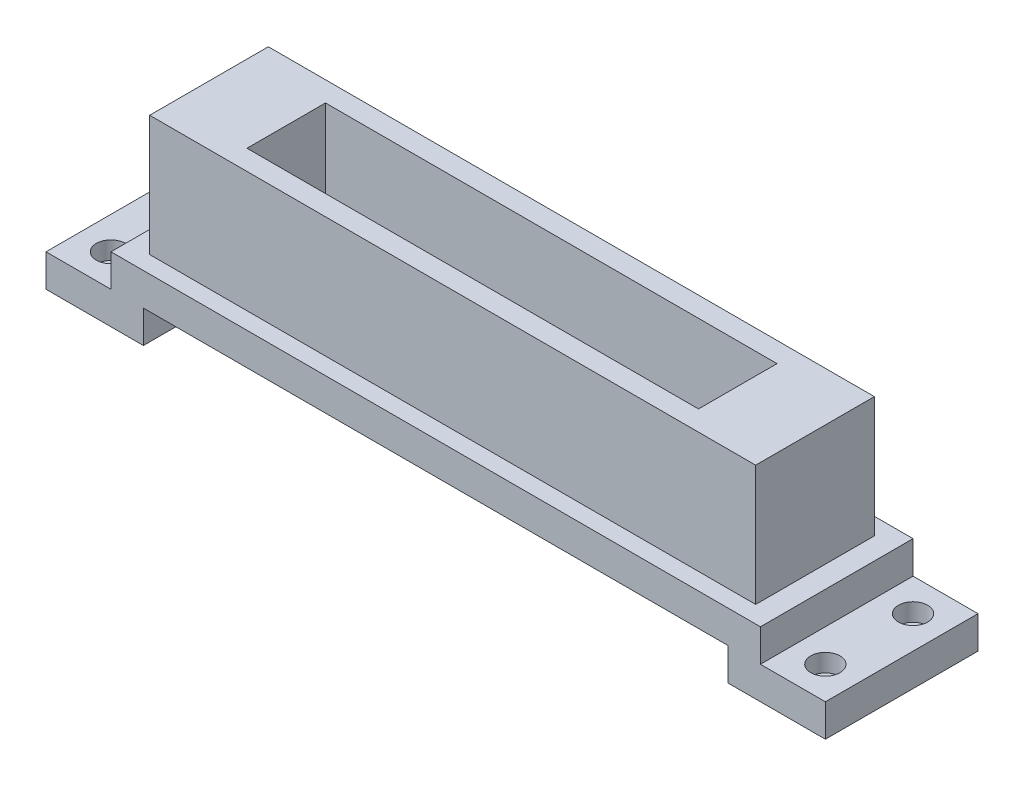
ISO-10303-21;
HEADER;
FILE_DESCRIPTION(('STEP AP214'),'2;1');
FILE_NAME('part.step','',(''),(''),'','','');
FILE_SCHEMA(('AUTOMOTIVE_DESIGN { 1 0 10303 214 1 1 1 1 }'));
ENDSEC;
DATA;
#1=APPLICATION_CONTEXT('core data for automotive mechanical design processes');
#2=APPLICATION_PROTOCOL_DEFINITION('international standard','automotive_design',2000,#1);
#3=PRODUCT_CONTEXT('',#1,'mechanical');
#4=PRODUCT('Part','Part','',(#3));
#5=PRODUCT_RELATED_PRODUCT_CATEGORY('part','',(#4));
#6=PRODUCT_DEFINITION_FORMATION('','',#4);
#7=PRODUCT_DEFINITION_CONTEXT('part definition',#1,'design');
#8=PRODUCT_DEFINITION('design','',#6,#7);
#9=PRODUCT_DEFINITION_SHAPE('','',#8);
#10=(LENGTH_UNIT() NAMED_UNIT(*) SI_UNIT(.MILLI.,.METRE.));
#11=(NAMED_UNIT(*) PLANE_ANGLE_UNIT() SI_UNIT($,.RADIAN.));
#12=(NAMED_UNIT(*) SI_UNIT($,.STERADIAN.) SOLID_ANGLE_UNIT());
#13=UNCERTAINTY_MEASURE_WITH_UNIT(LENGTH_MEASURE(1.E-05),#10,'distance_accuracy_value','');
#14=(GEOMETRIC_REPRESENTATION_CONTEXT(3) GLOBAL_UNCERTAINTY_ASSIGNED_CONTEXT((#13)) GLOBAL_UNIT_ASSIGNED_CONTEXT((#10,
#11,#12)) REPRESENTATION_CONTEXT('',''));
#15=CARTESIAN_POINT('',(0.,0.,0.));
#16=DIRECTION('',(0.,0.,1.));
#17=DIRECTION('',(1.,0.,0.));
#18=AXIS2_PLACEMENT_3D('',#15,#16,#17);
#19=CARTESIAN_POINT('',(0.,20.,0.));
#20=DIRECTION('',(0.,-1.,0.));
#21=DIRECTION('',(0.,0.,-1.));
#22=AXIS2_PLACEMENT_3D('',#19,#20,#21);
#23=PLANE('',#22);
#24=DIRECTION('',(-1.,0.,0.));
#25=VECTOR('',#24,1.);
#26=CARTESIAN_POINT('',(240.,20.,47.));
#27=LINE('',#26,#25);
#28=CARTESIAN_POINT('',(200.,20.,47.));
#29=VERTEX_POINT('',#28);
#30=CARTESIAN_POINT('',(-200.,20.,47.));
#31=VERTEX_POINT('',#30);
#32=EDGE_CURVE('E421',#29,#31,#27,.T.);
#33=ORIENTED_EDGE('',*,*,#32,.F.);
#34=DIRECTION('',(0.,0.,-1.));
#35=VECTOR('',#34,1.);
#36=CARTESIAN_POINT('',(200.,20.,47.));
#37=LINE('',#36,#35);
#38=CARTESIAN_POINT('',(200.,20.,-47.));
#39=VERTEX_POINT('',#38);
#40=EDGE_CURVE('E353',#29,#39,#37,.T.);
#41=ORIENTED_EDGE('',*,*,#40,.T.);
#42=DIRECTION('',(1.,0.,0.));
#43=VECTOR('',#42,1.);
#44=CARTESIAN_POINT('',(-240.,20.,-47.));
#45=LINE('',#44,#43);
#46=CARTESIAN_POINT('',(-200.,20.,-47.));
#47=VERTEX_POINT('',#46);
#48=EDGE_CURVE('E428',#47,#39,#45,.T.);
#49=ORIENTED_EDGE('',*,*,#48,.F.);
#50=DIRECTION('',(0.,0.,-1.));
#51=VECTOR('',#50,1.);
#52=CARTESIAN_POINT('',(-200.,20.,47.));
#53=LINE('',#52,#51);
#54=EDGE_CURVE('E406',#31,#47,#53,.T.);
#55=ORIENTED_EDGE('',*,*,#54,.F.);
#56=EDGE_LOOP('',(#33,#41,#49,#55));
#57=FACE_BOUND('',#56,.T.);
#58=DIRECTION('',(0.,0.,-1.));
#59=VECTOR('',#58,1.);
#60=CARTESIAN_POINT('',(186.614845009006,20.,36.5494359654945));
#61=LINE('',#60,#59);
#62=CARTESIAN_POINT('',(186.614845009006,20.,36.5494359654945));
#63=VERTEX_POINT('',#62);
#64=CARTESIAN_POINT('',(186.614845009006,20.,-36.5494359654945));
#65=VERTEX_POINT('',#64);
#66=EDGE_CURVE('E66',#63,#65,#61,.T.);
#67=ORIENTED_EDGE('',*,*,#66,.F.);
#68=DIRECTION('',(1.,0.,0.));
#69=VECTOR('',#68,1.);
#70=CARTESIAN_POINT('',(-186.614845009006,20.,36.5494359654945));
#71=LINE('',#70,#69);
#72=CARTESIAN_POINT('',(-186.614845009006,20.,36.5494359654945));
#73=VERTEX_POINT('',#72);
#74=EDGE_CURVE('E232',#73,#63,#71,.T.);
#75=ORIENTED_EDGE('',*,*,#74,.F.);
#76=DIRECTION('',(0.,0.,1.));
#77=VECTOR('',#76,1.);
#78=CARTESIAN_POINT('',(-186.614845009006,20.,36.5494359654945));
#79=LINE('',#78,#77);
#80=CARTESIAN_POINT('',(-186.614845009006,20.,-36.5494359654945));
#81=VERTEX_POINT('',#80);
#82=EDGE_CURVE('E252',#81,#73,#79,.T.);
#83=ORIENTED_EDGE('',*,*,#82,.F.);
#84=DIRECTION('',(-1.,0.,0.));
#85=VECTOR('',#84,1.);
#86=CARTESIAN_POINT('',(-186.614845009006,20.,-36.5494359654945));
#87=LINE('',#86,#85);
#88=EDGE_CURVE('E250',#65,#81,#87,.T.);
#89=ORIENTED_EDGE('',*,*,#88,.F.);
#90=EDGE_LOOP('',(#67,#75,#83,#89));
#91=FACE_BOUND('',#90,.T.);
#92=ADVANCED_FACE('F43',(#57,#91),#23,.F.);
#93=CARTESIAN_POINT('',(240.,20.,47.));
#94=DIRECTION('',(0.,0.,1.));
#95=DIRECTION('',(1.,0.,0.));
#96=AXIS2_PLACEMENT_3D('',#93,#94,#95);
#97=PLANE('',#96);
#98=DIRECTION('',(-1.,0.,0.));
#99=VECTOR('',#98,1.);
#100=CARTESIAN_POINT('',(240.,0.,47.));
#101=LINE('',#100,#99);
#102=CARTESIAN_POINT('',(240.,0.,47.));
#103=VERTEX_POINT('',#102);
#104=CARTESIAN_POINT('',(200.,0.,47.));
#105=VERTEX_POINT('',#104);
#106=EDGE_CURVE('E340',#103,#105,#101,.T.);
#107=ORIENTED_EDGE('',*,*,#106,.T.);
#108=DIRECTION('',(0.,1.,0.));
#109=VECTOR('',#108,1.);
#110=CARTESIAN_POINT('',(200.,0.,47.));
#111=LINE('',#110,#109);
#112=EDGE_CURVE('E344',#105,#29,#111,.T.);
#113=ORIENTED_EDGE('',*,*,#112,.T.);
#114=ORIENTED_EDGE('',*,*,#32,.T.);
#115=DIRECTION('',(0.,-1.,0.));
#116=VECTOR('',#115,1.);
#117=CARTESIAN_POINT('',(-200.,20.,47.));
#118=LINE('',#117,#116);
#119=CARTESIAN_POINT('',(-200.,0.,47.));
#120=VERTEX_POINT('',#119);
#121=EDGE_CURVE('E396',#31,#120,#118,.T.);
#122=ORIENTED_EDGE('',*,*,#121,.T.);
#123=DIRECTION('',(-1.,0.,0.));
#124=VECTOR('',#123,1.);
#125=CARTESIAN_POINT('',(-200.,0.,47.));
#126=LINE('',#125,#124);
#127=CARTESIAN_POINT('',(-240.,0.,47.));
#128=VERTEX_POINT('',#127);
#129=EDGE_CURVE('E405',#120,#128,#126,.T.);
#130=ORIENTED_EDGE('',*,*,#129,.T.);
#131=DIRECTION('',(0.,-1.,0.));
#132=VECTOR('',#131,1.);
#133=CARTESIAN_POINT('',(-240.,20.,47.));
#134=LINE('',#133,#132);
#135=CARTESIAN_POINT('',(-240.,-20.,47.));
#136=VERTEX_POINT('',#135);
#137=EDGE_CURVE('E449',#128,#136,#134,.T.);
#138=ORIENTED_EDGE('',*,*,#137,.T.);
#139=DIRECTION('',(-1.,0.,0.));
#140=VECTOR('',#139,1.);
#141=CARTESIAN_POINT('',(240.,-20.,47.));
#142=LINE('',#141,#140);
#143=CARTESIAN_POINT('',(-180.,-20.,47.));
#144=VERTEX_POINT('',#143);
#145=EDGE_CURVE('E432',#144,#136,#142,.T.);
#146=ORIENTED_EDGE('',*,*,#145,.F.);
#147=DIRECTION('',(0.,1.,0.));
#148=VECTOR('',#147,1.);
#149=CARTESIAN_POINT('',(-180.,-20.,47.));
#150=LINE('',#149,#148);
#151=CARTESIAN_POINT('',(-180.,0.,47.));
#152=VERTEX_POINT('',#151);
#153=EDGE_CURVE('E366',#144,#152,#150,.T.);
#154=ORIENTED_EDGE('',*,*,#153,.T.);
#155=DIRECTION('',(1.,0.,0.));
#156=VECTOR('',#155,1.);
#157=CARTESIAN_POINT('',(-180.,0.,47.));
#158=LINE('',#157,#156);
#159=CARTESIAN_POINT('',(180.,0.,47.));
#160=VERTEX_POINT('',#159);
#161=EDGE_CURVE('E371',#152,#160,#158,.T.);
#162=ORIENTED_EDGE('',*,*,#161,.T.);
#163=DIRECTION('',(0.,-1.,0.));
#164=VECTOR('',#163,1.);
#165=CARTESIAN_POINT('',(180.,0.,47.));
#166=LINE('',#165,#164);
#167=CARTESIAN_POINT('',(180.,-20.,47.));
#168=VERTEX_POINT('',#167);
#169=EDGE_CURVE('E365',#160,#168,#166,.T.);
#170=ORIENTED_EDGE('',*,*,#169,.T.);
#171=CARTESIAN_POINT('',(240.,-20.,47.));
#172=VERTEX_POINT('',#171);
#173=EDGE_CURVE('E434',#172,#168,#142,.T.);
#174=ORIENTED_EDGE('',*,*,#173,.F.);
#175=DIRECTION('',(0.,-1.,0.));
#176=VECTOR('',#175,1.);
#177=CARTESIAN_POINT('',(240.,20.,47.));
#178=LINE('',#177,#176);
#179=EDGE_CURVE('E50',#103,#172,#178,.T.);
#180=ORIENTED_EDGE('',*,*,#179,.F.);
#181=EDGE_LOOP('',(#107,#113,#114,#122,#130,#138,#146,#154,#162,#170,#174,#180));
#182=FACE_BOUND('',#181,.T.);
#183=ADVANCED_FACE('F462',(#182),#97,.T.);
#184=CARTESIAN_POINT('',(0.,-20.,0.));
#185=DIRECTION('',(0.,-1.,0.));
#186=DIRECTION('',(0.,0.,-1.));
#187=AXIS2_PLACEMENT_3D('',#184,#185,#186);
#188=PLANE('',#187);
#189=CARTESIAN_POINT('',(220.,-20.,27.));
#190=DIRECTION('',(0.,1.,0.));
#191=DIRECTION('',(0.,0.,1.));
#192=AXIS2_PLACEMENT_3D('',#189,#190,#191);
#193=CIRCLE('',#192,5.50000000000001);
#194=CARTESIAN_POINT('',(220.,-20.,32.5));
#195=VERTEX_POINT('',#194);
#196=EDGE_CURVE('E281',#195,#195,#193,.T.);
#197=ORIENTED_EDGE('',*,*,#196,.T.);
#198=EDGE_LOOP('',(#197));
#199=FACE_BOUND('',#198,.T.);
#200=CARTESIAN_POINT('',(220.,-20.,-27.));
#201=DIRECTION('',(0.,1.,0.));
#202=DIRECTION('',(0.,0.,1.));
#203=AXIS2_PLACEMENT_3D('',#200,#201,#202);
#204=CIRCLE('',#203,5.50000000000001);
#205=CARTESIAN_POINT('',(220.,-20.,-21.5));
#206=VERTEX_POINT('',#205);
#207=EDGE_CURVE('E297',#206,#206,#204,.T.);
#208=ORIENTED_EDGE('',*,*,#207,.T.);
#209=EDGE_LOOP('',(#208));
#210=FACE_BOUND('',#209,.T.);
#211=ORIENTED_EDGE('',*,*,#173,.T.);
#212=DIRECTION('',(0.,0.,-1.));
#213=VECTOR('',#212,1.);
#214=CARTESIAN_POINT('',(180.,-20.,47.));
#215=LINE('',#214,#213);
#216=CARTESIAN_POINT('',(180.,-20.,-47.));
#217=VERTEX_POINT('',#216);
#218=EDGE_CURVE('E374',#168,#217,#215,.T.);
#219=ORIENTED_EDGE('',*,*,#218,.T.);
#220=DIRECTION('',(1.,0.,0.));
#221=VECTOR('',#220,1.);
#222=CARTESIAN_POINT('',(-240.,-20.,-47.));
#223=LINE('',#222,#221);
#224=CARTESIAN_POINT('',(240.,-20.,-47.));
#225=VERTEX_POINT('',#224);
#226=EDGE_CURVE('E442',#217,#225,#223,.T.);
#227=ORIENTED_EDGE('',*,*,#226,.T.);
#228=DIRECTION('',(0.,0.,1.));
#229=VECTOR('',#228,1.);
#230=CARTESIAN_POINT('',(240.,-20.,-47.));
#231=LINE('',#230,#229);
#232=EDGE_CURVE('E420',#225,#172,#231,.T.);
#233=ORIENTED_EDGE('',*,*,#232,.T.);
#234=EDGE_LOOP('',(#211,#219,#227,#233));
#235=FACE_BOUND('',#234,.T.);
#236=ADVANCED_FACE('F466',(#199,#210,#235),#188,.T.);
#237=CARTESIAN_POINT('',(-240.,20.,47.));
#238=DIRECTION('',(-1.,0.,0.));
#239=DIRECTION('',(0.,0.,1.));
#240=AXIS2_PLACEMENT_3D('',#237,#238,#239);
#241=PLANE('',#240);
#242=ORIENTED_EDGE('',*,*,#137,.F.);
#243=DIRECTION('',(0.,0.,-1.));
#244=VECTOR('',#243,1.);
#245=CARTESIAN_POINT('',(-240.,0.,47.));
#246=LINE('',#245,#244);
#247=CARTESIAN_POINT('',(-240.,0.,-47.));
#248=VERTEX_POINT('',#247);
#249=EDGE_CURVE('E414',#128,#248,#246,.T.);
#250=ORIENTED_EDGE('',*,*,#249,.T.);
#251=DIRECTION('',(0.,-1.,0.));
#252=VECTOR('',#251,1.);
#253=CARTESIAN_POINT('',(-240.,20.,-47.));
#254=LINE('',#253,#252);
#255=CARTESIAN_POINT('',(-240.,-20.,-47.));
#256=VERTEX_POINT('',#255);
#257=EDGE_CURVE('E52',#248,#256,#254,.T.);
#258=ORIENTED_EDGE('',*,*,#257,.T.);
#259=DIRECTION('',(0.,0.,-1.));
#260=VECTOR('',#259,1.);
#261=CARTESIAN_POINT('',(-240.,-20.,47.));
#262=LINE('',#261,#260);
#263=EDGE_CURVE('E437',#136,#256,#262,.T.);
#264=ORIENTED_EDGE('',*,*,#263,.F.);
#265=EDGE_LOOP('',(#242,#250,#258,#264));
#266=FACE_BOUND('',#265,.T.);
#267=ADVANCED_FACE('F556',(#266),#241,.T.);
#268=CARTESIAN_POINT('',(240.,20.,-47.));
#269=DIRECTION('',(1.,0.,0.));
#270=DIRECTION('',(0.,0.,-1.));
#271=AXIS2_PLACEMENT_3D('',#268,#269,#270);
#272=PLANE('',#271);
#273=DIRECTION('',(0.,0.,-1.));
#274=VECTOR('',#273,1.);
#275=CARTESIAN_POINT('',(240.,0.,47.));
#276=LINE('',#275,#274);
#277=CARTESIAN_POINT('',(240.,0.,-47.));
#278=VERTEX_POINT('',#277);
#279=EDGE_CURVE('E347',#103,#278,#276,.T.);
#280=ORIENTED_EDGE('',*,*,#279,.F.);
#281=ORIENTED_EDGE('',*,*,#179,.T.);
#282=ORIENTED_EDGE('',*,*,#232,.F.);
#283=DIRECTION('',(0.,-1.,0.));
#284=VECTOR('',#283,1.);
#285=CARTESIAN_POINT('',(240.,20.,-47.));
#286=LINE('',#285,#284);
#287=EDGE_CURVE('E11',#278,#225,#286,.T.);
#288=ORIENTED_EDGE('',*,*,#287,.F.);
#289=EDGE_LOOP('',(#280,#281,#282,#288));
#290=FACE_BOUND('',#289,.T.);
#291=ADVANCED_FACE('F44',(#290),#272,.T.);
#292=CARTESIAN_POINT('',(-240.,20.,-47.));
#293=DIRECTION('',(0.,0.,-1.));
#294=DIRECTION('',(-1.,0.,0.));
#295=AXIS2_PLACEMENT_3D('',#292,#293,#294);
#296=PLANE('',#295);
#297=DIRECTION('',(-1.,0.,0.));
#298=VECTOR('',#297,1.);
#299=CARTESIAN_POINT('',(240.,0.,-47.));
#300=LINE('',#299,#298);
#301=CARTESIAN_POINT('',(200.,0.,-47.));
#302=VERTEX_POINT('',#301);
#303=EDGE_CURVE('E337',#278,#302,#300,.T.);
#304=ORIENTED_EDGE('',*,*,#303,.F.);
#305=ORIENTED_EDGE('',*,*,#287,.T.);
#306=ORIENTED_EDGE('',*,*,#226,.F.);
#307=DIRECTION('',(0.,-1.,0.));
#308=VECTOR('',#307,1.);
#309=CARTESIAN_POINT('',(180.,0.,-47.));
#310=LINE('',#309,#308);
#311=CARTESIAN_POINT('',(180.,0.,-47.));
#312=VERTEX_POINT('',#311);
#313=EDGE_CURVE('E354',#312,#217,#310,.T.);
#314=ORIENTED_EDGE('',*,*,#313,.F.);
#315=DIRECTION('',(1.,0.,0.));
#316=VECTOR('',#315,1.);
#317=CARTESIAN_POINT('',(-180.,0.,-47.));
#318=LINE('',#317,#316);
#319=CARTESIAN_POINT('',(-180.,0.,-47.));
#320=VERTEX_POINT('',#319);
#321=EDGE_CURVE('E370',#320,#312,#318,.T.);
#322=ORIENTED_EDGE('',*,*,#321,.F.);
#323=DIRECTION('',(0.,1.,0.));
#324=VECTOR('',#323,1.);
#325=CARTESIAN_POINT('',(-180.,-20.,-47.));
#326=LINE('',#325,#324);
#327=CARTESIAN_POINT('',(-180.,-20.,-47.));
#328=VERTEX_POINT('',#327);
#329=EDGE_CURVE('E377',#328,#320,#326,.T.);
#330=ORIENTED_EDGE('',*,*,#329,.F.);
#331=EDGE_CURVE('E430',#256,#328,#223,.T.);
#332=ORIENTED_EDGE('',*,*,#331,.F.);
#333=ORIENTED_EDGE('',*,*,#257,.F.);
#334=DIRECTION('',(-1.,0.,0.));
#335=VECTOR('',#334,1.);
#336=CARTESIAN_POINT('',(-200.,0.,-47.));
#337=LINE('',#336,#335);
#338=CARTESIAN_POINT('',(-200.,0.,-47.));
#339=VERTEX_POINT('',#338);
#340=EDGE_CURVE('E401',#339,#248,#337,.T.);
#341=ORIENTED_EDGE('',*,*,#340,.F.);
#342=DIRECTION('',(0.,-1.,0.));
#343=VECTOR('',#342,1.);
#344=CARTESIAN_POINT('',(-200.,20.,-47.));
#345=LINE('',#344,#343);
#346=EDGE_CURVE('E386',#47,#339,#345,.T.);
#347=ORIENTED_EDGE('',*,*,#346,.F.);
#348=ORIENTED_EDGE('',*,*,#48,.T.);
#349=DIRECTION('',(0.,1.,0.));
#350=VECTOR('',#349,1.);
#351=CARTESIAN_POINT('',(200.,0.,-47.));
#352=LINE('',#351,#350);
#353=EDGE_CURVE('E341',#302,#39,#352,.T.);
#354=ORIENTED_EDGE('',*,*,#353,.F.);
#355=EDGE_LOOP('',(#304,#305,#306,#314,#322,#330,#332,#333,#341,#347,#348,#354));
#356=FACE_BOUND('',#355,.T.);
#357=ADVANCED_FACE('F551',(#356),#296,.T.);
#358=CARTESIAN_POINT('',(-220.,-20.,27.));
#359=DIRECTION('',(0.,1.,0.));
#360=DIRECTION('',(0.,0.,1.));
#361=AXIS2_PLACEMENT_3D('',#358,#359,#360);
#362=CIRCLE('',#361,5.50000000000001);
#363=CARTESIAN_POINT('',(-220.,-20.,32.5));
#364=VERTEX_POINT('',#363);
#365=EDGE_CURVE('E317',#364,#364,#362,.T.);
#366=ORIENTED_EDGE('',*,*,#365,.T.);
#367=EDGE_LOOP('',(#366));
#368=FACE_BOUND('',#367,.T.);
#369=CARTESIAN_POINT('',(-220.,-20.,-27.));
#370=DIRECTION('',(0.,1.,0.));
#371=DIRECTION('',(0.,0.,1.));
#372=AXIS2_PLACEMENT_3D('',#369,#370,#371);
#373=CIRCLE('',#372,5.50000000000001);
#374=CARTESIAN_POINT('',(-220.,-20.,-21.5));
#375=VERTEX_POINT('',#374);
#376=EDGE_CURVE('E335',#375,#375,#373,.T.);
#377=ORIENTED_EDGE('',*,*,#376,.T.);
#378=EDGE_LOOP('',(#377));
#379=FACE_BOUND('',#378,.T.);
#380=DIRECTION('',(0.,0.,-1.));
#381=VECTOR('',#380,1.);
#382=CARTESIAN_POINT('',(-180.,-20.,47.));
#383=LINE('',#382,#381);
#384=EDGE_CURVE('E395',#144,#328,#383,.T.);
#385=ORIENTED_EDGE('',*,*,#384,.F.);
#386=ORIENTED_EDGE('',*,*,#145,.T.);
#387=ORIENTED_EDGE('',*,*,#263,.T.);
#388=ORIENTED_EDGE('',*,*,#331,.T.);
#389=EDGE_LOOP('',(#385,#386,#387,#388));
#390=FACE_BOUND('',#389,.T.);
#391=ADVANCED_FACE('F542',(#368,#379,#390),#188,.T.);
#392=CARTESIAN_POINT('',(-200.,0.,47.));
#393=DIRECTION('',(0.,-1.,0.));
#394=DIRECTION('',(0.,0.,-1.));
#395=AXIS2_PLACEMENT_3D('',#392,#393,#394);
#396=PLANE('',#395);
#397=CARTESIAN_POINT('',(-220.,0.,27.));
#398=DIRECTION('',(0.,1.,0.));
#399=DIRECTION('',(0.,0.,1.));
#400=AXIS2_PLACEMENT_3D('',#397,#398,#399);
#401=CIRCLE('',#400,8.99999999999998);
#402=CARTESIAN_POINT('',(-220.,0.,36.));
#403=VERTEX_POINT('',#402);
#404=EDGE_CURVE('E302',#403,#403,#401,.T.);
#405=ORIENTED_EDGE('',*,*,#404,.F.);
#406=EDGE_LOOP('',(#405));
#407=FACE_BOUND('',#406,.T.);
#408=CARTESIAN_POINT('',(-220.,0.,-27.));
#409=DIRECTION('',(0.,1.,0.));
#410=DIRECTION('',(0.,0.,1.));
#411=AXIS2_PLACEMENT_3D('',#408,#409,#410);
#412=CIRCLE('',#411,8.99999999999998);
#413=CARTESIAN_POINT('',(-220.,0.,-18.));
#414=VERTEX_POINT('',#413);
#415=EDGE_CURVE('E318',#414,#414,#412,.T.);
#416=ORIENTED_EDGE('',*,*,#415,.F.);
#417=EDGE_LOOP('',(#416));
#418=FACE_BOUND('',#417,.T.);
#419=ORIENTED_EDGE('',*,*,#340,.T.);
#420=ORIENTED_EDGE('',*,*,#249,.F.);
#421=ORIENTED_EDGE('',*,*,#129,.F.);
#422=DIRECTION('',(0.,0.,-1.));
#423=VECTOR('',#422,1.);
#424=CARTESIAN_POINT('',(-200.,0.,47.));
#425=LINE('',#424,#423);
#426=EDGE_CURVE('E416',#120,#339,#425,.T.);
#427=ORIENTED_EDGE('',*,*,#426,.T.);
#428=EDGE_LOOP('',(#419,#420,#421,#427));
#429=FACE_BOUND('',#428,.T.);
#430=ADVANCED_FACE('F561',(#407,#418,#429),#396,.F.);
#431=CARTESIAN_POINT('',(-200.,20.,47.));
#432=DIRECTION('',(1.,0.,0.));
#433=DIRECTION('',(0.,0.,-1.));
#434=AXIS2_PLACEMENT_3D('',#431,#432,#433);
#435=PLANE('',#434);
#436=ORIENTED_EDGE('',*,*,#346,.T.);
#437=ORIENTED_EDGE('',*,*,#426,.F.);
#438=ORIENTED_EDGE('',*,*,#121,.F.);
#439=ORIENTED_EDGE('',*,*,#54,.T.);
#440=EDGE_LOOP('',(#436,#437,#438,#439));
#441=FACE_BOUND('',#440,.T.);
#442=ADVANCED_FACE('F566',(#441),#435,.F.);
#443=CARTESIAN_POINT('',(180.,0.,47.));
#444=DIRECTION('',(1.,0.,0.));
#445=DIRECTION('',(0.,0.,-1.));
#446=AXIS2_PLACEMENT_3D('',#443,#444,#445);
#447=PLANE('',#446);
#448=ORIENTED_EDGE('',*,*,#313,.T.);
#449=ORIENTED_EDGE('',*,*,#218,.F.);
#450=ORIENTED_EDGE('',*,*,#169,.F.);
#451=DIRECTION('',(0.,0.,-1.));
#452=VECTOR('',#451,1.);
#453=CARTESIAN_POINT('',(180.,0.,47.));
#454=LINE('',#453,#452);
#455=EDGE_CURVE('E381',#160,#312,#454,.T.);
#456=ORIENTED_EDGE('',*,*,#455,.T.);
#457=EDGE_LOOP('',(#448,#449,#450,#456));
#458=FACE_BOUND('',#457,.T.);
#459=ADVANCED_FACE('F553',(#458),#447,.F.);
#460=CARTESIAN_POINT('',(-180.,0.,47.));
#461=DIRECTION('',(0.,1.,0.));
#462=DIRECTION('',(0.,0.,1.));
#463=AXIS2_PLACEMENT_3D('',#460,#461,#462);
#464=PLANE('',#463);
#465=ORIENTED_EDGE('',*,*,#321,.T.);
#466=ORIENTED_EDGE('',*,*,#455,.F.);
#467=ORIENTED_EDGE('',*,*,#161,.F.);
#468=DIRECTION('',(0.,0.,-1.));
#469=VECTOR('',#468,1.);
#470=CARTESIAN_POINT('',(-180.,0.,47.));
#471=LINE('',#470,#469);
#472=EDGE_CURVE('E390',#152,#320,#471,.T.);
#473=ORIENTED_EDGE('',*,*,#472,.T.);
#474=EDGE_LOOP('',(#465,#466,#467,#473));
#475=FACE_BOUND('',#474,.T.);
#476=ADVANCED_FACE('F547',(#475),#464,.F.);
#477=CARTESIAN_POINT('',(-180.,-20.,47.));
#478=DIRECTION('',(-1.,0.,0.));
#479=DIRECTION('',(0.,0.,1.));
#480=AXIS2_PLACEMENT_3D('',#477,#478,#479);
#481=PLANE('',#480);
#482=ORIENTED_EDGE('',*,*,#329,.T.);
#483=ORIENTED_EDGE('',*,*,#472,.F.);
#484=ORIENTED_EDGE('',*,*,#153,.F.);
#485=ORIENTED_EDGE('',*,*,#384,.T.);
#486=EDGE_LOOP('',(#482,#483,#484,#485));
#487=FACE_BOUND('',#486,.T.);
#488=ADVANCED_FACE('F543',(#487),#481,.F.);
#489=CARTESIAN_POINT('',(200.,0.,47.));
#490=DIRECTION('',(-1.,0.,0.));
#491=DIRECTION('',(0.,0.,1.));
#492=AXIS2_PLACEMENT_3D('',#489,#490,#491);
#493=PLANE('',#492);
#494=ORIENTED_EDGE('',*,*,#353,.T.);
#495=ORIENTED_EDGE('',*,*,#40,.F.);
#496=ORIENTED_EDGE('',*,*,#112,.F.);
#497=DIRECTION('',(0.,0.,-1.));
#498=VECTOR('',#497,1.);
#499=CARTESIAN_POINT('',(200.,0.,47.));
#500=LINE('',#499,#498);
#501=EDGE_CURVE('E358',#105,#302,#500,.T.);
#502=ORIENTED_EDGE('',*,*,#501,.T.);
#503=EDGE_LOOP('',(#494,#495,#496,#502));
#504=FACE_BOUND('',#503,.T.);
#505=ADVANCED_FACE('F571',(#504),#493,.F.);
#506=CARTESIAN_POINT('',(240.,0.,47.));
#507=DIRECTION('',(0.,-1.,0.));
#508=DIRECTION('',(0.,0.,-1.));
#509=AXIS2_PLACEMENT_3D('',#506,#507,#508);
#510=PLANE('',#509);
#511=CARTESIAN_POINT('',(220.,0.,27.));
#512=DIRECTION('',(0.,1.,0.));
#513=DIRECTION('',(0.,0.,1.));
#514=AXIS2_PLACEMENT_3D('',#511,#512,#513);
#515=CIRCLE('',#514,8.99999999999998);
#516=CARTESIAN_POINT('',(220.,0.,36.));
#517=VERTEX_POINT('',#516);
#518=EDGE_CURVE('E275',#517,#517,#515,.T.);
#519=ORIENTED_EDGE('',*,*,#518,.F.);
#520=EDGE_LOOP('',(#519));
#521=FACE_BOUND('',#520,.T.);
#522=CARTESIAN_POINT('',(220.,0.,-27.));
#523=DIRECTION('',(0.,1.,0.));
#524=DIRECTION('',(0.,0.,1.));
#525=AXIS2_PLACEMENT_3D('',#522,#523,#524);
#526=CIRCLE('',#525,8.99999999999998);
#527=CARTESIAN_POINT('',(220.,0.,-18.));
#528=VERTEX_POINT('',#527);
#529=EDGE_CURVE('E286',#528,#528,#526,.T.);
#530=ORIENTED_EDGE('',*,*,#529,.F.);
#531=EDGE_LOOP('',(#530));
#532=FACE_BOUND('',#531,.T.);
#533=ORIENTED_EDGE('',*,*,#303,.T.);
#534=ORIENTED_EDGE('',*,*,#501,.F.);
#535=ORIENTED_EDGE('',*,*,#106,.F.);
#536=ORIENTED_EDGE('',*,*,#279,.T.);
#537=EDGE_LOOP('',(#533,#534,#535,#536));
#538=FACE_BOUND('',#537,.T.);
#539=ADVANCED_FACE('F573',(#521,#532,#538),#510,.F.);
#540=CARTESIAN_POINT('',(-220.,0.,-27.));
#541=DIRECTION('',(0.,1.,0.));
#542=DIRECTION('',(0.,0.,1.));
#543=AXIS2_PLACEMENT_3D('',#540,#541,#542);
#544=CYLINDRICAL_SURFACE('',#543,5.50000000000001);
#545=ORIENTED_EDGE('',*,*,#376,.F.);
#546=EDGE_LOOP('',(#545));
#547=FACE_BOUND('',#546,.T.);
#548=CARTESIAN_POINT('',(-220.,-11.,-27.));
#549=DIRECTION('',(0.,1.,0.));
#550=DIRECTION('',(0.,0.,1.));
#551=AXIS2_PLACEMENT_3D('',#548,#549,#550);
#552=CIRCLE('',#551,5.50000000000001);
#553=CARTESIAN_POINT('',(-220.,-11.,-21.5));
#554=VERTEX_POINT('',#553);
#555=EDGE_CURVE('E329',#554,#554,#552,.T.);
#556=ORIENTED_EDGE('',*,*,#555,.T.);
#557=EDGE_LOOP('',(#556));
#558=FACE_BOUND('',#557,.T.);
#559=ADVANCED_FACE('F577',(#547,#558),#544,.F.);
#560=CARTESIAN_POINT('',(-214.5,-11.,-27.));
#561=DIRECTION('',(0.,-1.,0.));
#562=DIRECTION('',(0.,0.,-1.));
#563=AXIS2_PLACEMENT_3D('',#560,#561,#562);
#564=PLANE('',#563);
#565=ORIENTED_EDGE('',*,*,#555,.F.);
#566=EDGE_LOOP('',(#565));
#567=FACE_BOUND('',#566,.T.);
#568=CARTESIAN_POINT('',(-220.,-11.,-27.));
#569=DIRECTION('',(0.,1.,0.));
#570=DIRECTION('',(0.,0.,1.));
#571=AXIS2_PLACEMENT_3D('',#568,#569,#570);
#572=CIRCLE('',#571,8.99999999999998);
#573=CARTESIAN_POINT('',(-220.,-11.,-18.));
#574=VERTEX_POINT('',#573);
#575=EDGE_CURVE('E323',#574,#574,#572,.T.);
#576=ORIENTED_EDGE('',*,*,#575,.T.);
#577=EDGE_LOOP('',(#576));
#578=FACE_BOUND('',#577,.T.);
#579=ADVANCED_FACE('F585',(#567,#578),#564,.F.);
#580=CARTESIAN_POINT('',(-220.,0.,-27.));
#581=DIRECTION('',(0.,1.,0.));
#582=DIRECTION('',(0.,0.,1.));
#583=AXIS2_PLACEMENT_3D('',#580,#581,#582);
#584=CYLINDRICAL_SURFACE('',#583,8.99999999999998);
#585=ORIENTED_EDGE('',*,*,#575,.F.);
#586=EDGE_LOOP('',(#585));
#587=FACE_BOUND('',#586,.T.);
#588=ORIENTED_EDGE('',*,*,#415,.T.);
#589=EDGE_LOOP('',(#588));
#590=FACE_BOUND('',#589,.T.);
#591=ADVANCED_FACE('F658',(#587,#590),#584,.F.);
#592=CARTESIAN_POINT('',(-220.,0.,27.));
#593=DIRECTION('',(0.,1.,0.));
#594=DIRECTION('',(0.,0.,1.));
#595=AXIS2_PLACEMENT_3D('',#592,#593,#594);
#596=CYLINDRICAL_SURFACE('',#595,5.50000000000001);
#597=ORIENTED_EDGE('',*,*,#365,.F.);
#598=EDGE_LOOP('',(#597));
#599=FACE_BOUND('',#598,.T.);
#600=CARTESIAN_POINT('',(-220.,-11.,27.));
#601=DIRECTION('',(0.,1.,0.));
#602=DIRECTION('',(0.,0.,1.));
#603=AXIS2_PLACEMENT_3D('',#600,#601,#602);
#604=CIRCLE('',#603,5.50000000000001);
#605=CARTESIAN_POINT('',(-220.,-11.,32.5));
#606=VERTEX_POINT('',#605);
#607=EDGE_CURVE('E315',#606,#606,#604,.T.);
#608=ORIENTED_EDGE('',*,*,#607,.T.);
#609=EDGE_LOOP('',(#608));
#610=FACE_BOUND('',#609,.T.);
#611=ADVANCED_FACE('F655',(#599,#610),#596,.F.);
#612=CARTESIAN_POINT('',(-214.5,-11.,27.));
#613=DIRECTION('',(0.,-1.,0.));
#614=DIRECTION('',(0.,0.,-1.));
#615=AXIS2_PLACEMENT_3D('',#612,#613,#614);
#616=PLANE('',#615);
#617=ORIENTED_EDGE('',*,*,#607,.F.);
#618=EDGE_LOOP('',(#617));
#619=FACE_BOUND('',#618,.T.);
#620=CARTESIAN_POINT('',(-220.,-11.,27.));
#621=DIRECTION('',(0.,1.,0.));
#622=DIRECTION('',(0.,0.,1.));
#623=AXIS2_PLACEMENT_3D('',#620,#621,#622);
#624=CIRCLE('',#623,8.99999999999998);
#625=CARTESIAN_POINT('',(-220.,-11.,36.));
#626=VERTEX_POINT('',#625);
#627=EDGE_CURVE('E308',#626,#626,#624,.T.);
#628=ORIENTED_EDGE('',*,*,#627,.T.);
#629=EDGE_LOOP('',(#628));
#630=FACE_BOUND('',#629,.T.);
#631=ADVANCED_FACE('F650',(#619,#630),#616,.F.);
#632=CARTESIAN_POINT('',(-220.,0.,27.));
#633=DIRECTION('',(0.,1.,0.));
#634=DIRECTION('',(0.,0.,1.));
#635=AXIS2_PLACEMENT_3D('',#632,#633,#634);
#636=CYLINDRICAL_SURFACE('',#635,8.99999999999998);
#637=ORIENTED_EDGE('',*,*,#627,.F.);
#638=EDGE_LOOP('',(#637));
#639=FACE_BOUND('',#638,.T.);
#640=ORIENTED_EDGE('',*,*,#404,.T.);
#641=EDGE_LOOP('',(#640));
#642=FACE_BOUND('',#641,.T.);
#643=ADVANCED_FACE('F621',(#639,#642),#636,.F.);
#644=CARTESIAN_POINT('',(220.,0.,-27.));
#645=DIRECTION('',(0.,1.,0.));
#646=DIRECTION('',(0.,0.,1.));
#647=AXIS2_PLACEMENT_3D('',#644,#645,#646);
#648=CYLINDRICAL_SURFACE('',#647,5.50000000000001);
#649=ORIENTED_EDGE('',*,*,#207,.F.);
#650=EDGE_LOOP('',(#649));
#651=FACE_BOUND('',#650,.T.);
#652=CARTESIAN_POINT('',(220.,-11.,-27.));
#653=DIRECTION('',(0.,1.,0.));
#654=DIRECTION('',(0.,0.,1.));
#655=AXIS2_PLACEMENT_3D('',#652,#653,#654);
#656=CIRCLE('',#655,5.50000000000001);
#657=CARTESIAN_POINT('',(220.,-11.,-21.5));
#658=VERTEX_POINT('',#657);
#659=EDGE_CURVE('E298',#658,#658,#656,.T.);
#660=ORIENTED_EDGE('',*,*,#659,.T.);
#661=EDGE_LOOP('',(#660));
#662=FACE_BOUND('',#661,.T.);
#663=ADVANCED_FACE('F620',(#651,#662),#648,.F.);
#664=CARTESIAN_POINT('',(225.5,-11.,-27.));
#665=DIRECTION('',(0.,-1.,0.));
#666=DIRECTION('',(0.,0.,-1.));
#667=AXIS2_PLACEMENT_3D('',#664,#665,#666);
#668=PLANE('',#667);
#669=ORIENTED_EDGE('',*,*,#659,.F.);
#670=EDGE_LOOP('',(#669));
#671=FACE_BOUND('',#670,.T.);
#672=CARTESIAN_POINT('',(220.,-11.,-27.));
#673=DIRECTION('',(0.,1.,0.));
#674=DIRECTION('',(0.,0.,1.));
#675=AXIS2_PLACEMENT_3D('',#672,#673,#674);
#676=CIRCLE('',#675,8.99999999999998);
#677=CARTESIAN_POINT('',(220.,-11.,-18.));
#678=VERTEX_POINT('',#677);
#679=EDGE_CURVE('E292',#678,#678,#676,.T.);
#680=ORIENTED_EDGE('',*,*,#679,.T.);
#681=EDGE_LOOP('',(#680));
#682=FACE_BOUND('',#681,.T.);
#683=ADVANCED_FACE('F625',(#671,#682),#668,.F.);
#684=CARTESIAN_POINT('',(220.,0.,-27.));
#685=DIRECTION('',(0.,1.,0.));
#686=DIRECTION('',(0.,0.,1.));
#687=AXIS2_PLACEMENT_3D('',#684,#685,#686);
#688=CYLINDRICAL_SURFACE('',#687,8.99999999999998);
#689=ORIENTED_EDGE('',*,*,#679,.F.);
#690=EDGE_LOOP('',(#689));
#691=FACE_BOUND('',#690,.T.);
#692=ORIENTED_EDGE('',*,*,#529,.T.);
#693=EDGE_LOOP('',(#692));
#694=FACE_BOUND('',#693,.T.);
#695=ADVANCED_FACE('F627',(#691,#694),#688,.F.);
#696=CARTESIAN_POINT('',(220.,0.,27.));
#697=DIRECTION('',(0.,1.,0.));
#698=DIRECTION('',(0.,0.,1.));
#699=AXIS2_PLACEMENT_3D('',#696,#697,#698);
#700=CYLINDRICAL_SURFACE('',#699,5.50000000000001);
#701=ORIENTED_EDGE('',*,*,#196,.F.);
#702=EDGE_LOOP('',(#701));
#703=FACE_BOUND('',#702,.T.);
#704=CARTESIAN_POINT('',(220.,-11.,27.));
#705=DIRECTION('',(0.,1.,0.));
#706=DIRECTION('',(0.,0.,1.));
#707=AXIS2_PLACEMENT_3D('',#704,#705,#706);
#708=CIRCLE('',#707,5.50000000000001);
#709=CARTESIAN_POINT('',(220.,-11.,32.5));
#710=VERTEX_POINT('',#709);
#711=EDGE_CURVE('E277',#710,#710,#708,.T.);
#712=ORIENTED_EDGE('',*,*,#711,.T.);
#713=EDGE_LOOP('',(#712));
#714=FACE_BOUND('',#713,.T.);
#715=ADVANCED_FACE('F634',(#703,#714),#700,.F.);
#716=CARTESIAN_POINT('',(225.5,-11.,27.));
#717=DIRECTION('',(0.,-1.,0.));
#718=DIRECTION('',(0.,0.,-1.));
#719=AXIS2_PLACEMENT_3D('',#716,#717,#718);
#720=PLANE('',#719);
#721=ORIENTED_EDGE('',*,*,#711,.F.);
#722=EDGE_LOOP('',(#721));
#723=FACE_BOUND('',#722,.T.);
#724=CARTESIAN_POINT('',(220.,-11.,27.));
#725=DIRECTION('',(0.,1.,0.));
#726=DIRECTION('',(0.,0.,1.));
#727=AXIS2_PLACEMENT_3D('',#724,#725,#726);
#728=CIRCLE('',#727,8.99999999999998);
#729=CARTESIAN_POINT('',(220.,-11.,36.));
#730=VERTEX_POINT('',#729);
#731=EDGE_CURVE('E279',#730,#730,#728,.T.);
#732=ORIENTED_EDGE('',*,*,#731,.T.);
#733=EDGE_LOOP('',(#732));
#734=FACE_BOUND('',#733,.T.);
#735=ADVANCED_FACE('F642',(#723,#734),#720,.F.);
#736=CARTESIAN_POINT('',(220.,0.,27.));
#737=DIRECTION('',(0.,1.,0.));
#738=DIRECTION('',(0.,0.,1.));
#739=AXIS2_PLACEMENT_3D('',#736,#737,#738);
#740=CYLINDRICAL_SURFACE('',#739,8.99999999999998);
#741=ORIENTED_EDGE('',*,*,#731,.F.);
#742=EDGE_LOOP('',(#741));
#743=FACE_BOUND('',#742,.T.);
#744=ORIENTED_EDGE('',*,*,#518,.T.);
#745=EDGE_LOOP('',(#744));
#746=FACE_BOUND('',#745,.T.);
#747=ADVANCED_FACE('F782',(#743,#746),#740,.F.);
#748=CARTESIAN_POINT('',(186.614845009006,94.29,36.5494359654945));
#749=DIRECTION('',(-1.,0.,0.));
#750=DIRECTION('',(0.,0.,1.));
#751=AXIS2_PLACEMENT_3D('',#748,#749,#750);
#752=PLANE('',#751);
#753=ORIENTED_EDGE('',*,*,#66,.T.);
#754=DIRECTION('',(0.,-1.,0.));
#755=VECTOR('',#754,1.);
#756=CARTESIAN_POINT('',(186.614845009006,94.29,-36.5494359654945));
#757=LINE('',#756,#755);
#758=CARTESIAN_POINT('',(186.614845009006,94.29,-36.5494359654945));
#759=VERTEX_POINT('',#758);
#760=EDGE_CURVE('E266',#759,#65,#757,.T.);
#761=ORIENTED_EDGE('',*,*,#760,.F.);
#762=DIRECTION('',(0.,0.,-1.));
#763=VECTOR('',#762,1.);
#764=CARTESIAN_POINT('',(186.614845009006,94.29,36.5494359654945));
#765=LINE('',#764,#763);
#766=CARTESIAN_POINT('',(186.614845009006,94.29,36.5494359654945));
#767=VERTEX_POINT('',#766);
#768=EDGE_CURVE('E229',#767,#759,#765,.T.);
#769=ORIENTED_EDGE('',*,*,#768,.F.);
#770=DIRECTION('',(0.,-1.,0.));
#771=VECTOR('',#770,1.);
#772=CARTESIAN_POINT('',(186.614845009006,94.29,36.5494359654945));
#773=LINE('',#772,#771);
#774=EDGE_CURVE('E242',#767,#63,#773,.T.);
#775=ORIENTED_EDGE('',*,*,#774,.T.);
#776=EDGE_LOOP('',(#753,#761,#769,#775));
#777=FACE_BOUND('',#776,.T.);
#778=ADVANCED_FACE('F786',(#777),#752,.F.);
#779=CARTESIAN_POINT('',(-186.614845009006,94.29,-36.5494359654945));
#780=DIRECTION('',(0.,0.,1.));
#781=DIRECTION('',(1.,0.,0.));
#782=AXIS2_PLACEMENT_3D('',#779,#780,#781);
#783=PLANE('',#782);
#784=ORIENTED_EDGE('',*,*,#88,.T.);
#785=DIRECTION('',(0.,-1.,0.));
#786=VECTOR('',#785,1.);
#787=CARTESIAN_POINT('',(-186.614845009006,94.29,-36.5494359654945));
#788=LINE('',#787,#786);
#789=CARTESIAN_POINT('',(-186.614845009006,94.29,-36.5494359654945));
#790=VERTEX_POINT('',#789);
#791=EDGE_CURVE('E261',#790,#81,#788,.T.);
#792=ORIENTED_EDGE('',*,*,#791,.F.);
#793=DIRECTION('',(-1.,0.,0.));
#794=VECTOR('',#793,1.);
#795=CARTESIAN_POINT('',(-186.614845009006,94.29,-36.5494359654945));
#796=LINE('',#795,#794);
#797=EDGE_CURVE('E234',#759,#790,#796,.T.);
#798=ORIENTED_EDGE('',*,*,#797,.F.);
#799=ORIENTED_EDGE('',*,*,#760,.T.);
#800=EDGE_LOOP('',(#784,#792,#798,#799));
#801=FACE_BOUND('',#800,.T.);
#802=ADVANCED_FACE('F805',(#801),#783,.F.);
#803=CARTESIAN_POINT('',(-186.614845009006,94.29,36.5494359654945));
#804=DIRECTION('',(1.,0.,0.));
#805=DIRECTION('',(0.,0.,-1.));
#806=AXIS2_PLACEMENT_3D('',#803,#804,#805);
#807=PLANE('',#806);
#808=ORIENTED_EDGE('',*,*,#82,.T.);
#809=DIRECTION('',(0.,-1.,0.));
#810=VECTOR('',#809,1.);
#811=CARTESIAN_POINT('',(-186.614845009006,94.29,36.5494359654945));
#812=LINE('',#811,#810);
#813=CARTESIAN_POINT('',(-186.614845009006,94.29,36.5494359654945));
#814=VERTEX_POINT('',#813);
#815=EDGE_CURVE('E257',#814,#73,#812,.T.);
#816=ORIENTED_EDGE('',*,*,#815,.F.);
#817=DIRECTION('',(0.,0.,1.));
#818=VECTOR('',#817,1.);
#819=CARTESIAN_POINT('',(-186.614845009006,94.29,36.5494359654945));
#820=LINE('',#819,#818);
#821=EDGE_CURVE('E238',#790,#814,#820,.T.);
#822=ORIENTED_EDGE('',*,*,#821,.F.);
#823=ORIENTED_EDGE('',*,*,#791,.T.);
#824=EDGE_LOOP('',(#808,#816,#822,#823));
#825=FACE_BOUND('',#824,.T.);
#826=ADVANCED_FACE('F812',(#825),#807,.F.);
#827=CARTESIAN_POINT('',(-186.614845009006,94.29,36.5494359654945));
#828=DIRECTION('',(0.,0.,-1.));
#829=DIRECTION('',(-1.,0.,0.));
#830=AXIS2_PLACEMENT_3D('',#827,#828,#829);
#831=PLANE('',#830);
#832=ORIENTED_EDGE('',*,*,#74,.T.);
#833=ORIENTED_EDGE('',*,*,#774,.F.);
#834=DIRECTION('',(1.,0.,0.));
#835=VECTOR('',#834,1.);
#836=CARTESIAN_POINT('',(-186.614845009006,94.29,36.5494359654945));
#837=LINE('',#836,#835);
#838=EDGE_CURVE('E241',#814,#767,#837,.T.);
#839=ORIENTED_EDGE('',*,*,#838,.F.);
#840=ORIENTED_EDGE('',*,*,#815,.T.);
#841=EDGE_LOOP('',(#832,#833,#839,#840));
#842=FACE_BOUND('',#841,.T.);
#843=ADVANCED_FACE('F825',(#842),#831,.F.);
#844=CARTESIAN_POINT('',(0.,94.29,0.));
#845=DIRECTION('',(0.,-1.,0.));
#846=DIRECTION('',(0.,0.,-1.));
#847=AXIS2_PLACEMENT_3D('',#844,#845,#846);
#848=PLANE('',#847);
#849=DIRECTION('',(0.,0.,1.));
#850=VECTOR('',#849,1.);
#851=CARTESIAN_POINT('',(-139.04256327614,94.29,24.1729073845866));
#852=LINE('',#851,#850);
#853=CARTESIAN_POINT('',(-139.04256327614,94.29,-24.1729073845866));
#854=VERTEX_POINT('',#853);
#855=CARTESIAN_POINT('',(-139.04256327614,94.29,24.1729073845866));
#856=VERTEX_POINT('',#855);
#857=EDGE_CURVE('E214',#854,#856,#852,.T.);
#858=ORIENTED_EDGE('',*,*,#857,.F.);
#859=DIRECTION('',(-1.,0.,0.));
#860=VECTOR('',#859,1.);
#861=CARTESIAN_POINT('',(-139.04256327614,94.29,-24.1729073845866));
#862=LINE('',#861,#860);
#863=CARTESIAN_POINT('',(139.04256327614,94.29,-24.1729073845866));
#864=VERTEX_POINT('',#863);
#865=EDGE_CURVE('E198',#864,#854,#862,.T.);
#866=ORIENTED_EDGE('',*,*,#865,.F.);
#867=DIRECTION('',(0.,0.,-1.));
#868=VECTOR('',#867,1.);
#869=CARTESIAN_POINT('',(139.04256327614,94.29,24.1729073845866));
#870=LINE('',#869,#868);
#871=CARTESIAN_POINT('',(139.04256327614,94.29,24.1729073845866));
#872=VERTEX_POINT('',#871);
#873=EDGE_CURVE('E212',#872,#864,#870,.T.);
#874=ORIENTED_EDGE('',*,*,#873,.F.);
#875=DIRECTION('',(1.,0.,0.));
#876=VECTOR('',#875,1.);
#877=CARTESIAN_POINT('',(-139.04256327614,94.29,24.1729073845866));
#878=LINE('',#877,#876);
#879=EDGE_CURVE('E64',#856,#872,#878,.T.);
#880=ORIENTED_EDGE('',*,*,#879,.F.);
#881=EDGE_LOOP('',(#858,#866,#874,#880));
#882=FACE_BOUND('',#881,.T.);
#883=ORIENTED_EDGE('',*,*,#768,.T.);
#884=ORIENTED_EDGE('',*,*,#797,.T.);
#885=ORIENTED_EDGE('',*,*,#821,.T.);
#886=ORIENTED_EDGE('',*,*,#838,.T.);
#887=EDGE_LOOP('',(#883,#884,#885,#886));
#888=FACE_BOUND('',#887,.T.);
#889=ADVANCED_FACE('F835',(#882,#888),#848,.F.);
#890=CARTESIAN_POINT('',(0.,20.,0.));
#891=DIRECTION('',(0.,-1.,0.));
#892=DIRECTION('',(0.,0.,-1.));
#893=AXIS2_PLACEMENT_3D('',#890,#891,#892);
#894=PLANE('',#893);
#895=DIRECTION('',(0.,0.,-1.));
#896=VECTOR('',#895,1.);
#897=CARTESIAN_POINT('',(139.04256327614,20.,24.1729073845866));
#898=LINE('',#897,#896);
#899=CARTESIAN_POINT('',(139.04256327614,20.,24.1729073845866));
#900=VERTEX_POINT('',#899);
#901=CARTESIAN_POINT('',(139.04256327614,20.,-24.1729073845866));
#902=VERTEX_POINT('',#901);
#903=EDGE_CURVE('E204',#900,#902,#898,.T.);
#904=ORIENTED_EDGE('',*,*,#903,.T.);
#905=DIRECTION('',(-1.,0.,0.));
#906=VECTOR('',#905,1.);
#907=CARTESIAN_POINT('',(-139.04256327614,20.,-24.1729073845866));
#908=LINE('',#907,#906);
#909=CARTESIAN_POINT('',(-139.04256327614,20.,-24.1729073845866));
#910=VERTEX_POINT('',#909);
#911=EDGE_CURVE('E200',#902,#910,#908,.T.);
#912=ORIENTED_EDGE('',*,*,#911,.T.);
#913=DIRECTION('',(0.,0.,1.));
#914=VECTOR('',#913,1.);
#915=CARTESIAN_POINT('',(-139.04256327614,20.,24.1729073845866));
#916=LINE('',#915,#914);
#917=CARTESIAN_POINT('',(-139.04256327614,20.,24.1729073845866));
#918=VERTEX_POINT('',#917);
#919=EDGE_CURVE('E182',#910,#918,#916,.T.);
#920=ORIENTED_EDGE('',*,*,#919,.T.);
#921=DIRECTION('',(1.,0.,0.));
#922=VECTOR('',#921,1.);
#923=CARTESIAN_POINT('',(-139.04256327614,20.,24.1729073845866));
#924=LINE('',#923,#922);
#925=EDGE_CURVE('E223',#918,#900,#924,.T.);
#926=ORIENTED_EDGE('',*,*,#925,.T.);
#927=EDGE_LOOP('',(#904,#912,#920,#926));
#928=FACE_BOUND('',#927,.T.);
#929=ADVANCED_FACE('F202',(#928),#894,.F.);
#930=CARTESIAN_POINT('',(-139.04256327614,-262.256364702893,-24.1729073845866));
#931=DIRECTION('',(0.,0.,-1.));
#932=DIRECTION('',(-1.,0.,0.));
#933=AXIS2_PLACEMENT_3D('',#930,#931,#932);
#934=PLANE('',#933);
#935=DIRECTION('',(0.,1.,0.));
#936=VECTOR('',#935,1.);
#937=CARTESIAN_POINT('',(139.04256327614,-262.256364702893,-24.1729073845866));
#938=LINE('',#937,#936);
#939=EDGE_CURVE('E216',#902,#864,#938,.T.);
#940=ORIENTED_EDGE('',*,*,#939,.T.);
#941=ORIENTED_EDGE('',*,*,#865,.T.);
#942=DIRECTION('',(0.,1.,0.));
#943=VECTOR('',#942,1.);
#944=CARTESIAN_POINT('',(-139.04256327614,-262.256364702893,-24.1729073845866));
#945=LINE('',#944,#943);
#946=EDGE_CURVE('E190',#910,#854,#945,.T.);
#947=ORIENTED_EDGE('',*,*,#946,.F.);
#948=ORIENTED_EDGE('',*,*,#911,.F.);
#949=EDGE_LOOP('',(#940,#941,#947,#948));
#950=FACE_BOUND('',#949,.T.);
#951=ADVANCED_FACE('F197',(#950),#934,.F.);
#952=CARTESIAN_POINT('',(-139.04256327614,-262.256364702893,24.1729073845866));
#953=DIRECTION('',(-1.,0.,0.));
#954=DIRECTION('',(0.,0.,1.));
#955=AXIS2_PLACEMENT_3D('',#952,#953,#954);
#956=PLANE('',#955);
#957=ORIENTED_EDGE('',*,*,#946,.T.);
#958=ORIENTED_EDGE('',*,*,#857,.T.);
#959=DIRECTION('',(0.,1.,0.));
#960=VECTOR('',#959,1.);
#961=CARTESIAN_POINT('',(-139.04256327614,-262.256364702893,24.1729073845866));
#962=LINE('',#961,#960);
#963=EDGE_CURVE('E186',#918,#856,#962,.T.);
#964=ORIENTED_EDGE('',*,*,#963,.F.);
#965=ORIENTED_EDGE('',*,*,#919,.F.);
#966=EDGE_LOOP('',(#957,#958,#964,#965));
#967=FACE_BOUND('',#966,.T.);
#968=ADVANCED_FACE('F184',(#967),#956,.F.);
#969=CARTESIAN_POINT('',(-139.04256327614,-262.256364702893,24.1729073845866));
#970=DIRECTION('',(0.,0.,1.));
#971=DIRECTION('',(1.,0.,0.));
#972=AXIS2_PLACEMENT_3D('',#969,#970,#971);
#973=PLANE('',#972);
#974=ORIENTED_EDGE('',*,*,#963,.T.);
#975=ORIENTED_EDGE('',*,*,#879,.T.);
#976=DIRECTION('',(0.,1.,0.));
#977=VECTOR('',#976,1.);
#978=CARTESIAN_POINT('',(139.04256327614,-262.256364702893,24.1729073845866));
#979=LINE('',#978,#977);
#980=EDGE_CURVE('E218',#900,#872,#979,.T.);
#981=ORIENTED_EDGE('',*,*,#980,.F.);
#982=ORIENTED_EDGE('',*,*,#925,.F.);
#983=EDGE_LOOP('',(#974,#975,#981,#982));
#984=FACE_BOUND('',#983,.T.);
#985=ADVANCED_FACE('F870',(#984),#973,.F.);
#986=CARTESIAN_POINT('',(139.04256327614,-262.256364702893,24.1729073845866));
#987=DIRECTION('',(1.,0.,0.));
#988=DIRECTION('',(0.,0.,-1.));
#989=AXIS2_PLACEMENT_3D('',#986,#987,#988);
#990=PLANE('',#989);
#991=ORIENTED_EDGE('',*,*,#980,.T.);
#992=ORIENTED_EDGE('',*,*,#873,.T.);
#993=ORIENTED_EDGE('',*,*,#939,.F.);
#994=ORIENTED_EDGE('',*,*,#903,.F.);
#995=EDGE_LOOP('',(#991,#992,#993,#994));
#996=FACE_BOUND('',#995,.T.);
#997=ADVANCED_FACE('F878',(#996),#990,.F.);
#998=CLOSED_SHELL('',(#92,#183,#236,#267,#291,#357,#391,#430,#442,#459,#476,#488,#505,#539,#559,
#579,#591,#611,#631,#643,#663,#683,#695,#715,#735,#747,#778,#802,#826,#843,#889,#929,#951,#968,
#985,#997));
#999=MANIFOLD_SOLID_BREP('B2',#998);
#1000=ADVANCED_BREP_SHAPE_REPRESENTATION('',(#18,#999),#14);
#1001=SHAPE_DEFINITION_REPRESENTATION(#9,#1000);
ENDSEC;
END-ISO-10303-21;
